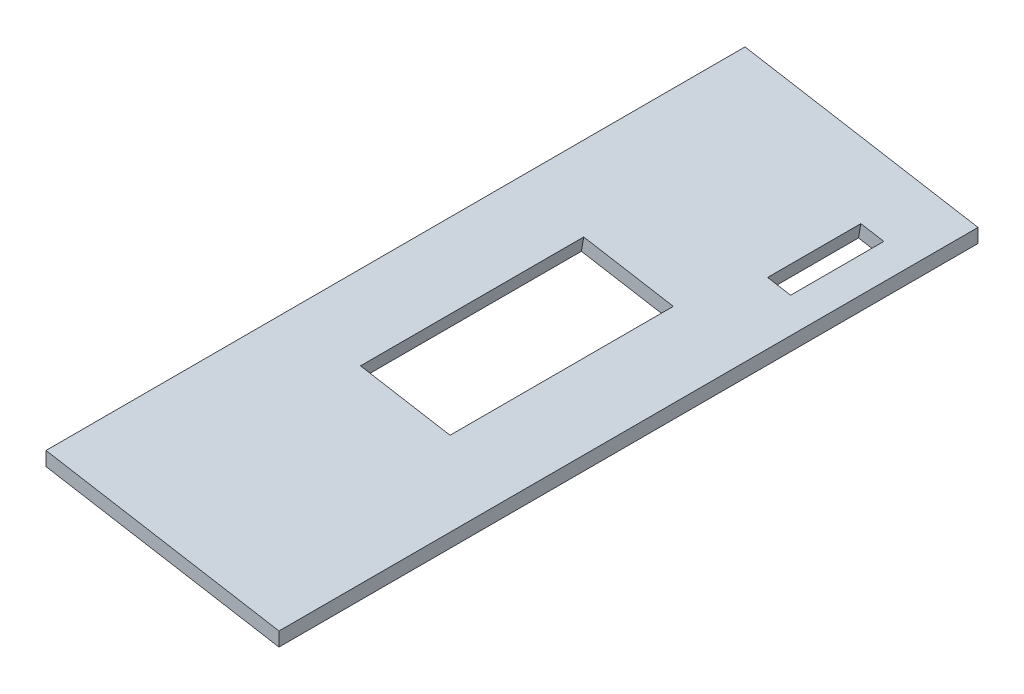
ISO-10303-21;
HEADER;
FILE_DESCRIPTION(('STEP AP214'),'2;1');
FILE_NAME('part.step','',(''),(''),'','','');
FILE_SCHEMA(('AUTOMOTIVE_DESIGN { 1 0 10303 214 1 1 1 1 }'));
ENDSEC;
DATA;
#1=APPLICATION_CONTEXT('core data for automotive mechanical design processes');
#2=APPLICATION_PROTOCOL_DEFINITION('international standard','automotive_design',2000,#1);
#3=PRODUCT_CONTEXT('',#1,'mechanical');
#4=PRODUCT('Part','Part','',(#3));
#5=PRODUCT_RELATED_PRODUCT_CATEGORY('part','',(#4));
#6=PRODUCT_DEFINITION_FORMATION('','',#4);
#7=PRODUCT_DEFINITION_CONTEXT('part definition',#1,'design');
#8=PRODUCT_DEFINITION('design','',#6,#7);
#9=PRODUCT_DEFINITION_SHAPE('','',#8);
#10=(LENGTH_UNIT() NAMED_UNIT(*) SI_UNIT(.MILLI.,.METRE.));
#11=(NAMED_UNIT(*) PLANE_ANGLE_UNIT() SI_UNIT($,.RADIAN.));
#12=(NAMED_UNIT(*) SI_UNIT($,.STERADIAN.) SOLID_ANGLE_UNIT());
#13=UNCERTAINTY_MEASURE_WITH_UNIT(LENGTH_MEASURE(1.E-05),#10,'distance_accuracy_value','');
#14=(GEOMETRIC_REPRESENTATION_CONTEXT(3) GLOBAL_UNCERTAINTY_ASSIGNED_CONTEXT((#13)) GLOBAL_UNIT_ASSIGNED_CONTEXT((#10,
#11,#12)) REPRESENTATION_CONTEXT('',''));
#15=CARTESIAN_POINT('',(0.,0.,0.));
#16=DIRECTION('',(0.,0.,1.));
#17=DIRECTION('',(1.,0.,0.));
#18=AXIS2_PLACEMENT_3D('',#15,#16,#17);
#19=CARTESIAN_POINT('',(-31.7951654155456,-27.4303947217968,300.));
#20=DIRECTION('',(0.168489379564996,0.985703469088855,0.));
#21=DIRECTION('',(-0.985703469088855,0.168489379564996,0.));
#22=AXIS2_PLACEMENT_3D('',#19,#20,#21);
#23=PLANE('',#22);
#24=DIRECTION('',(-0.985703469088855,0.168489379564996,0.));
#25=VECTOR('',#24,1.);
#26=CARTESIAN_POINT('',(-31.7951654155455,-27.4303947217968,27.6163170501561));
#27=LINE('',#26,#25);
#28=CARTESIAN_POINT('',(54.3942060906482,-42.1630137959683,27.6163170501561));
#29=VERTEX_POINT('',#28);
#30=CARTESIAN_POINT('',(44.5371713997597,-40.4781200003183,27.6163170501561));
#31=VERTEX_POINT('',#30);
#32=EDGE_CURVE('E152',#29,#31,#27,.T.);
#33=ORIENTED_EDGE('',*,*,#32,.T.);
#34=DIRECTION('',(0.,0.,1.));
#35=VECTOR('',#34,1.);
#36=CARTESIAN_POINT('',(44.5371713997597,-40.4781200003183,300.));
#37=LINE('',#36,#35);
#38=CARTESIAN_POINT('',(44.5371713997597,-40.4781200003183,67.6163170501561));
#39=VERTEX_POINT('',#38);
#40=EDGE_CURVE('E155',#31,#39,#37,.T.);
#41=ORIENTED_EDGE('',*,*,#40,.T.);
#42=DIRECTION('',(0.985703469088855,-0.168489379564996,0.));
#43=VECTOR('',#42,1.);
#44=CARTESIAN_POINT('',(-31.7951654155459,-27.4303947217967,67.6163170501562));
#45=LINE('',#44,#43);
#46=CARTESIAN_POINT('',(54.3942060906482,-42.1630137959683,67.6163170501561));
#47=VERTEX_POINT('',#46);
#48=EDGE_CURVE('E147',#39,#47,#45,.T.);
#49=ORIENTED_EDGE('',*,*,#48,.T.);
#50=DIRECTION('',(0.,0.,-1.));
#51=VECTOR('',#50,1.);
#52=CARTESIAN_POINT('',(54.3942060906483,-42.1630137959683,300.));
#53=LINE('',#52,#51);
#54=EDGE_CURVE('E127',#47,#29,#53,.T.);
#55=ORIENTED_EDGE('',*,*,#54,.T.);
#56=EDGE_LOOP('',(#33,#41,#49,#55));
#57=FACE_BOUND('',#56,.T.);
#58=DIRECTION('',(-0.985703469088855,0.168489379564996,0.));
#59=VECTOR('',#58,1.);
#60=CARTESIAN_POINT('',(-31.7951654155456,-27.4303947217968,100.));
#61=LINE('',#60,#59);
#62=CARTESIAN_POINT('',(36.429568836036,-39.0922621144938,100.));
#63=VERTEX_POINT('',#62);
#64=CARTESIAN_POINT('',(-2.01286645842935,-32.521176311459,100.));
#65=VERTEX_POINT('',#64);
#66=EDGE_CURVE('E184',#63,#65,#61,.T.);
#67=ORIENTED_EDGE('',*,*,#66,.T.);
#68=DIRECTION('',(0.,0.,1.));
#69=VECTOR('',#68,1.);
#70=CARTESIAN_POINT('',(-2.01286645842931,-32.521176311459,300.));
#71=LINE('',#70,#69);
#72=CARTESIAN_POINT('',(-2.01286645842933,-32.521176311459,195.8));
#73=VERTEX_POINT('',#72);
#74=EDGE_CURVE('E187',#65,#73,#71,.T.);
#75=ORIENTED_EDGE('',*,*,#74,.T.);
#76=DIRECTION('',(0.985703469088855,-0.168489379564996,0.));
#77=VECTOR('',#76,1.);
#78=CARTESIAN_POINT('',(-31.7951654155456,-27.4303947217968,195.8));
#79=LINE('',#78,#77);
#80=CARTESIAN_POINT('',(36.429568836036,-39.0922621144938,195.8));
#81=VERTEX_POINT('',#80);
#82=EDGE_CURVE('E172',#73,#81,#79,.T.);
#83=ORIENTED_EDGE('',*,*,#82,.T.);
#84=DIRECTION('',(0.,0.,-1.));
#85=VECTOR('',#84,1.);
#86=CARTESIAN_POINT('',(36.429568836036,-39.0922621144938,300.));
#87=LINE('',#86,#85);
#88=EDGE_CURVE('E181',#81,#63,#87,.T.);
#89=ORIENTED_EDGE('',*,*,#88,.T.);
#90=EDGE_LOOP('',(#67,#75,#83,#89));
#91=FACE_BOUND('',#90,.T.);
#92=DIRECTION('',(0.985703469088855,-0.168489379564996,0.));
#93=VECTOR('',#92,1.);
#94=CARTESIAN_POINT('',(-31.7951654155456,-27.4303947217968,0.));
#95=LINE('',#94,#93);
#96=CARTESIAN_POINT('',(-31.7951654155456,-27.4303947217968,0.));
#97=VERTEX_POINT('',#96);
#98=CARTESIAN_POINT('',(68.2048345844544,-44.5237077564704,0.));
#99=VERTEX_POINT('',#98);
#100=EDGE_CURVE('E190',#97,#99,#95,.T.);
#101=ORIENTED_EDGE('',*,*,#100,.T.);
#102=DIRECTION('',(0.,0.,-1.));
#103=VECTOR('',#102,1.);
#104=CARTESIAN_POINT('',(68.2048345844544,-44.5237077564704,300.));
#105=LINE('',#104,#103);
#106=CARTESIAN_POINT('',(68.2048345844544,-44.5237077564704,300.));
#107=VERTEX_POINT('',#106);
#108=EDGE_CURVE('E11',#107,#99,#105,.T.);
#109=ORIENTED_EDGE('',*,*,#108,.F.);
#110=DIRECTION('',(0.985703469088855,-0.168489379564996,0.));
#111=VECTOR('',#110,1.);
#112=CARTESIAN_POINT('',(-31.7951654155456,-27.4303947217968,300.));
#113=LINE('',#112,#111);
#114=CARTESIAN_POINT('',(-31.7951654155456,-27.4303947217968,300.));
#115=VERTEX_POINT('',#114);
#116=EDGE_CURVE('E191',#115,#107,#113,.T.);
#117=ORIENTED_EDGE('',*,*,#116,.F.);
#118=DIRECTION('',(0.,0.,-1.));
#119=VECTOR('',#118,1.);
#120=CARTESIAN_POINT('',(-31.7951654155456,-27.4303947217968,300.));
#121=LINE('',#120,#119);
#122=EDGE_CURVE('E201',#115,#97,#121,.T.);
#123=ORIENTED_EDGE('',*,*,#122,.T.);
#124=EDGE_LOOP('',(#101,#109,#117,#123));
#125=FACE_BOUND('',#124,.T.);
#126=ADVANCED_FACE('F33',(#57,#91,#125),#23,.F.);
#127=CARTESIAN_POINT('',(68.2048345844544,-44.5237077564704,300.));
#128=DIRECTION('',(-1.,0.,0.));
#129=DIRECTION('',(0.,0.,1.));
#130=AXIS2_PLACEMENT_3D('',#127,#128,#129);
#131=PLANE('',#130);
#132=DIRECTION('',(0.,1.,0.));
#133=VECTOR('',#132,1.);
#134=CARTESIAN_POINT('',(68.2048345844544,-44.5237077564704,0.));
#135=LINE('',#134,#133);
#136=CARTESIAN_POINT('',(68.2048345844544,-38.5237077564704,0.));
#137=VERTEX_POINT('',#136);
#138=EDGE_CURVE('E204',#99,#137,#135,.T.);
#139=ORIENTED_EDGE('',*,*,#138,.T.);
#140=DIRECTION('',(0.,0.,-1.));
#141=VECTOR('',#140,1.);
#142=CARTESIAN_POINT('',(68.2048345844544,-38.5237077564704,300.));
#143=LINE('',#142,#141);
#144=CARTESIAN_POINT('',(68.2048345844544,-38.5237077564704,300.));
#145=VERTEX_POINT('',#144);
#146=EDGE_CURVE('E40',#145,#137,#143,.T.);
#147=ORIENTED_EDGE('',*,*,#146,.F.);
#148=DIRECTION('',(0.,1.,0.));
#149=VECTOR('',#148,1.);
#150=CARTESIAN_POINT('',(68.2048345844544,-44.5237077564704,300.));
#151=LINE('',#150,#149);
#152=EDGE_CURVE('E194',#107,#145,#151,.T.);
#153=ORIENTED_EDGE('',*,*,#152,.F.);
#154=ORIENTED_EDGE('',*,*,#108,.T.);
#155=EDGE_LOOP('',(#139,#147,#153,#154));
#156=FACE_BOUND('',#155,.T.);
#157=ADVANCED_FACE('F233',(#156),#131,.F.);
#158=CARTESIAN_POINT('',(68.2048345844544,-38.5237077564704,300.));
#159=DIRECTION('',(-0.168489379564996,-0.985703469088855,0.));
#160=DIRECTION('',(0.985703469088855,-0.168489379564996,0.));
#161=AXIS2_PLACEMENT_3D('',#158,#159,#160);
#162=PLANE('',#161);
#163=DIRECTION('',(0.985703469088855,-0.168489379564995,0.));
#164=VECTOR('',#163,1.);
#165=CARTESIAN_POINT('',(45.5336547954107,-34.6484520264755,67.6163170501561));
#166=LINE('',#165,#164);
#167=CARTESIAN_POINT('',(45.5336547954107,-34.6484520264755,67.6163170501561));
#168=VERTEX_POINT('',#167);
#169=CARTESIAN_POINT('',(55.3906894862993,-36.3333458221255,67.6163170501561));
#170=VERTEX_POINT('',#169);
#171=EDGE_CURVE('E133',#168,#170,#166,.T.);
#172=ORIENTED_EDGE('',*,*,#171,.F.);
#173=DIRECTION('',(0.,0.,1.));
#174=VECTOR('',#173,1.);
#175=CARTESIAN_POINT('',(45.5336547954107,-34.6484520264755,27.6163170501561));
#176=LINE('',#175,#174);
#177=CARTESIAN_POINT('',(45.5336547954107,-34.6484520264755,27.6163170501561));
#178=VERTEX_POINT('',#177);
#179=EDGE_CURVE('E55',#178,#168,#176,.T.);
#180=ORIENTED_EDGE('',*,*,#179,.F.);
#181=DIRECTION('',(-0.985703469088855,0.168489379564996,0.));
#182=VECTOR('',#181,1.);
#183=CARTESIAN_POINT('',(45.5336547954107,-34.6484520264755,27.6163170501561));
#184=LINE('',#183,#182);
#185=CARTESIAN_POINT('',(55.3906894862993,-36.3333458221255,27.6163170501561));
#186=VERTEX_POINT('',#185);
#187=EDGE_CURVE('E140',#186,#178,#184,.T.);
#188=ORIENTED_EDGE('',*,*,#187,.F.);
#189=DIRECTION('',(0.,0.,-1.));
#190=VECTOR('',#189,1.);
#191=CARTESIAN_POINT('',(55.3906894862993,-36.3333458221255,27.6163170501561));
#192=LINE('',#191,#190);
#193=EDGE_CURVE('E124',#170,#186,#192,.T.);
#194=ORIENTED_EDGE('',*,*,#193,.F.);
#195=EDGE_LOOP('',(#172,#180,#188,#194));
#196=FACE_BOUND('',#195,.T.);
#197=DIRECTION('',(0.985703469088855,-0.168489379564996,0.));
#198=VECTOR('',#197,1.);
#199=CARTESIAN_POINT('',(-1.01638306277827,-26.6915083376162,195.8));
#200=LINE('',#199,#198);
#201=CARTESIAN_POINT('',(-1.01638306277826,-26.6915083376162,195.8));
#202=VERTEX_POINT('',#201);
#203=CARTESIAN_POINT('',(37.4260522316871,-33.262594140651,195.8));
#204=VERTEX_POINT('',#203);
#205=EDGE_CURVE('E160',#202,#204,#200,.T.);
#206=ORIENTED_EDGE('',*,*,#205,.F.);
#207=DIRECTION('',(0.,0.,1.));
#208=VECTOR('',#207,1.);
#209=CARTESIAN_POINT('',(-1.01638306277827,-26.6915083376162,195.8));
#210=LINE('',#209,#208);
#211=CARTESIAN_POINT('',(-1.01638306277829,-26.6915083376162,100.));
#212=VERTEX_POINT('',#211);
#213=EDGE_CURVE('E158',#212,#202,#210,.T.);
#214=ORIENTED_EDGE('',*,*,#213,.F.);
#215=DIRECTION('',(-0.985703469088855,0.168489379564996,0.));
#216=VECTOR('',#215,1.);
#217=CARTESIAN_POINT('',(-1.01638306277829,-26.6915083376162,100.));
#218=LINE('',#217,#216);
#219=CARTESIAN_POINT('',(37.4260522316871,-33.262594140651,100.));
#220=VERTEX_POINT('',#219);
#221=EDGE_CURVE('E166',#220,#212,#218,.T.);
#222=ORIENTED_EDGE('',*,*,#221,.F.);
#223=DIRECTION('',(0.,0.,-1.));
#224=VECTOR('',#223,1.);
#225=CARTESIAN_POINT('',(37.4260522316871,-33.262594140651,195.8));
#226=LINE('',#225,#224);
#227=EDGE_CURVE('E163',#204,#220,#226,.T.);
#228=ORIENTED_EDGE('',*,*,#227,.F.);
#229=EDGE_LOOP('',(#206,#214,#222,#228));
#230=FACE_BOUND('',#229,.T.);
#231=DIRECTION('',(-0.985703469088855,0.168489379564996,0.));
#232=VECTOR('',#231,1.);
#233=CARTESIAN_POINT('',(68.2048345844544,-38.5237077564704,0.));
#234=LINE('',#233,#232);
#235=CARTESIAN_POINT('',(-31.7951654155456,-21.4303947217968,0.));
#236=VERTEX_POINT('',#235);
#237=EDGE_CURVE('E206',#137,#236,#234,.T.);
#238=ORIENTED_EDGE('',*,*,#237,.T.);
#239=DIRECTION('',(0.,0.,-1.));
#240=VECTOR('',#239,1.);
#241=CARTESIAN_POINT('',(-31.7951654155456,-21.4303947217968,300.));
#242=LINE('',#241,#240);
#243=CARTESIAN_POINT('',(-31.7951654155456,-21.4303947217968,300.));
#244=VERTEX_POINT('',#243);
#245=EDGE_CURVE('E211',#244,#236,#242,.T.);
#246=ORIENTED_EDGE('',*,*,#245,.F.);
#247=DIRECTION('',(-0.985703469088855,0.168489379564996,0.));
#248=VECTOR('',#247,1.);
#249=CARTESIAN_POINT('',(68.2048345844544,-38.5237077564704,300.));
#250=LINE('',#249,#248);
#251=EDGE_CURVE('E197',#145,#244,#250,.T.);
#252=ORIENTED_EDGE('',*,*,#251,.F.);
#253=ORIENTED_EDGE('',*,*,#146,.T.);
#254=EDGE_LOOP('',(#238,#246,#252,#253));
#255=FACE_BOUND('',#254,.T.);
#256=ADVANCED_FACE('F137',(#196,#230,#255),#162,.F.);
#257=CARTESIAN_POINT('',(-31.7951654155456,-21.4303947217968,300.));
#258=DIRECTION('',(1.,0.,0.));
#259=DIRECTION('',(0.,1.,0.));
#260=AXIS2_PLACEMENT_3D('',#257,#258,#259);
#261=PLANE('',#260);
#262=DIRECTION('',(0.,-1.,0.));
#263=VECTOR('',#262,1.);
#264=CARTESIAN_POINT('',(-31.7951654155456,-21.4303947217968,0.));
#265=LINE('',#264,#263);
#266=EDGE_CURVE('E195',#236,#97,#265,.T.);
#267=ORIENTED_EDGE('',*,*,#266,.T.);
#268=ORIENTED_EDGE('',*,*,#122,.F.);
#269=DIRECTION('',(0.,-1.,0.));
#270=VECTOR('',#269,1.);
#271=CARTESIAN_POINT('',(-31.7951654155456,-21.4303947217968,300.));
#272=LINE('',#271,#270);
#273=EDGE_CURVE('E199',#244,#115,#272,.T.);
#274=ORIENTED_EDGE('',*,*,#273,.F.);
#275=ORIENTED_EDGE('',*,*,#245,.T.);
#276=EDGE_LOOP('',(#267,#268,#274,#275));
#277=FACE_BOUND('',#276,.T.);
#278=ADVANCED_FACE('F226',(#277),#261,.F.);
#279=CARTESIAN_POINT('',(0.,0.,300.));
#280=DIRECTION('',(0.,0.,1.));
#281=DIRECTION('',(1.,0.,0.));
#282=AXIS2_PLACEMENT_3D('',#279,#280,#281);
#283=PLANE('',#282);
#284=ORIENTED_EDGE('',*,*,#116,.T.);
#285=ORIENTED_EDGE('',*,*,#152,.T.);
#286=ORIENTED_EDGE('',*,*,#251,.T.);
#287=ORIENTED_EDGE('',*,*,#273,.T.);
#288=EDGE_LOOP('',(#284,#285,#286,#287));
#289=FACE_BOUND('',#288,.T.);
#290=ADVANCED_FACE('F232',(#289),#283,.T.);
#291=CARTESIAN_POINT('',(0.,0.,0.));
#292=DIRECTION('',(0.,0.,1.));
#293=DIRECTION('',(1.,0.,0.));
#294=AXIS2_PLACEMENT_3D('',#291,#292,#293);
#295=PLANE('',#294);
#296=ORIENTED_EDGE('',*,*,#100,.F.);
#297=ORIENTED_EDGE('',*,*,#266,.F.);
#298=ORIENTED_EDGE('',*,*,#237,.F.);
#299=ORIENTED_EDGE('',*,*,#138,.F.);
#300=EDGE_LOOP('',(#296,#297,#298,#299));
#301=FACE_BOUND('',#300,.T.);
#302=ADVANCED_FACE('F223',(#301),#295,.F.);
#303=CARTESIAN_POINT('',(-3.5437237562532,-41.477060373949,195.8));
#304=DIRECTION('',(-0.985703469088855,0.168489379564996,0.));
#305=DIRECTION('',(-0.168489379564996,-0.985703469088855,0.));
#306=AXIS2_PLACEMENT_3D('',#303,#304,#305);
#307=PLANE('',#306);
#308=DIRECTION('',(0.168489379564996,0.985703469088855,0.));
#309=VECTOR('',#308,1.);
#310=CARTESIAN_POINT('',(-3.54372375625322,-41.477060373949,100.));
#311=LINE('',#310,#309);
#312=EDGE_CURVE('E170',#65,#212,#311,.T.);
#313=ORIENTED_EDGE('',*,*,#312,.T.);
#314=ORIENTED_EDGE('',*,*,#213,.T.);
#315=DIRECTION('',(0.168489379564996,0.985703469088855,0.));
#316=VECTOR('',#315,1.);
#317=CARTESIAN_POINT('',(-3.5437237562532,-41.477060373949,195.8));
#318=LINE('',#317,#316);
#319=EDGE_CURVE('E169',#73,#202,#318,.T.);
#320=ORIENTED_EDGE('',*,*,#319,.F.);
#321=ORIENTED_EDGE('',*,*,#74,.F.);
#322=EDGE_LOOP('',(#313,#314,#320,#321));
#323=FACE_BOUND('',#322,.T.);
#324=ADVANCED_FACE('F246',(#323),#307,.F.);
#325=CARTESIAN_POINT('',(-3.54372375625322,-41.477060373949,100.));
#326=DIRECTION('',(0.,0.,-1.));
#327=DIRECTION('',(-1.,0.,0.));
#328=AXIS2_PLACEMENT_3D('',#325,#326,#327);
#329=PLANE('',#328);
#330=DIRECTION('',(0.168489379564996,0.985703469088855,0.));
#331=VECTOR('',#330,1.);
#332=CARTESIAN_POINT('',(34.8987115382121,-48.0481461769839,100.));
#333=LINE('',#332,#331);
#334=EDGE_CURVE('E173',#63,#220,#333,.T.);
#335=ORIENTED_EDGE('',*,*,#334,.T.);
#336=ORIENTED_EDGE('',*,*,#221,.T.);
#337=ORIENTED_EDGE('',*,*,#312,.F.);
#338=ORIENTED_EDGE('',*,*,#66,.F.);
#339=EDGE_LOOP('',(#335,#336,#337,#338));
#340=FACE_BOUND('',#339,.T.);
#341=ADVANCED_FACE('F251',(#340),#329,.F.);
#342=CARTESIAN_POINT('',(34.8987115382121,-48.0481461769838,195.8));
#343=DIRECTION('',(0.985703469088855,-0.168489379564996,0.));
#344=DIRECTION('',(0.168489379564996,0.985703469088855,0.));
#345=AXIS2_PLACEMENT_3D('',#342,#343,#344);
#346=PLANE('',#345);
#347=DIRECTION('',(0.168489379564996,0.985703469088855,0.));
#348=VECTOR('',#347,1.);
#349=CARTESIAN_POINT('',(34.8987115382121,-48.0481461769838,195.8));
#350=LINE('',#349,#348);
#351=EDGE_CURVE('E175',#81,#204,#350,.T.);
#352=ORIENTED_EDGE('',*,*,#351,.T.);
#353=ORIENTED_EDGE('',*,*,#227,.T.);
#354=ORIENTED_EDGE('',*,*,#334,.F.);
#355=ORIENTED_EDGE('',*,*,#88,.F.);
#356=EDGE_LOOP('',(#352,#353,#354,#355));
#357=FACE_BOUND('',#356,.T.);
#358=ADVANCED_FACE('F257',(#357),#346,.F.);
#359=CARTESIAN_POINT('',(-3.5437237562532,-41.477060373949,195.8));
#360=DIRECTION('',(0.,0.,1.));
#361=DIRECTION('',(1.,0.,0.));
#362=AXIS2_PLACEMENT_3D('',#359,#360,#361);
#363=PLANE('',#362);
#364=ORIENTED_EDGE('',*,*,#319,.T.);
#365=ORIENTED_EDGE('',*,*,#205,.T.);
#366=ORIENTED_EDGE('',*,*,#351,.F.);
#367=ORIENTED_EDGE('',*,*,#82,.F.);
#368=EDGE_LOOP('',(#364,#365,#366,#367));
#369=FACE_BOUND('',#368,.T.);
#370=ADVANCED_FACE('F253',(#369),#363,.F.);
#371=CARTESIAN_POINT('',(43.8487609997608,-44.5054867173641,27.6163170501561));
#372=DIRECTION('',(-0.985703469088855,0.168489379564996,0.));
#373=DIRECTION('',(-0.168489379564996,-0.985703469088855,0.));
#374=AXIS2_PLACEMENT_3D('',#371,#372,#373);
#375=PLANE('',#374);
#376=DIRECTION('',(0.168489379564996,0.985703469088855,0.));
#377=VECTOR('',#376,1.);
#378=CARTESIAN_POINT('',(43.8487609997608,-44.5054867173641,27.6163170501561));
#379=LINE('',#378,#377);
#380=EDGE_CURVE('E145',#31,#178,#379,.T.);
#381=ORIENTED_EDGE('',*,*,#380,.T.);
#382=ORIENTED_EDGE('',*,*,#179,.T.);
#383=DIRECTION('',(0.168489379564996,0.985703469088855,0.));
#384=VECTOR('',#383,1.);
#385=CARTESIAN_POINT('',(43.8487609997608,-44.5054867173641,67.6163170501561));
#386=LINE('',#385,#384);
#387=EDGE_CURVE('E130',#39,#168,#386,.T.);
#388=ORIENTED_EDGE('',*,*,#387,.F.);
#389=ORIENTED_EDGE('',*,*,#40,.F.);
#390=EDGE_LOOP('',(#381,#382,#388,#389));
#391=FACE_BOUND('',#390,.T.);
#392=ADVANCED_FACE('F256',(#391),#375,.F.);
#393=CARTESIAN_POINT('',(43.8487609997608,-44.5054867173641,27.6163170501561));
#394=DIRECTION('',(0.,0.,-1.));
#395=DIRECTION('',(-1.,0.,0.));
#396=AXIS2_PLACEMENT_3D('',#393,#394,#395);
#397=PLANE('',#396);
#398=DIRECTION('',(0.168489379564996,0.985703469088855,0.));
#399=VECTOR('',#398,1.);
#400=CARTESIAN_POINT('',(53.7057956906493,-46.190380513014,27.6163170501561));
#401=LINE('',#400,#399);
#402=EDGE_CURVE('E129',#29,#186,#401,.T.);
#403=ORIENTED_EDGE('',*,*,#402,.T.);
#404=ORIENTED_EDGE('',*,*,#187,.T.);
#405=ORIENTED_EDGE('',*,*,#380,.F.);
#406=ORIENTED_EDGE('',*,*,#32,.F.);
#407=EDGE_LOOP('',(#403,#404,#405,#406));
#408=FACE_BOUND('',#407,.T.);
#409=ADVANCED_FACE('F267',(#408),#397,.F.);
#410=CARTESIAN_POINT('',(53.7057956906493,-46.190380513014,27.6163170501561));
#411=DIRECTION('',(0.985703469088855,-0.168489379564996,0.));
#412=DIRECTION('',(0.168489379564996,0.985703469088855,0.));
#413=AXIS2_PLACEMENT_3D('',#410,#411,#412);
#414=PLANE('',#413);
#415=DIRECTION('',(0.168489379564996,0.985703469088855,0.));
#416=VECTOR('',#415,1.);
#417=CARTESIAN_POINT('',(53.7057956906493,-46.190380513014,67.6163170501561));
#418=LINE('',#417,#416);
#419=EDGE_CURVE('E47',#47,#170,#418,.T.);
#420=ORIENTED_EDGE('',*,*,#419,.T.);
#421=ORIENTED_EDGE('',*,*,#193,.T.);
#422=ORIENTED_EDGE('',*,*,#402,.F.);
#423=ORIENTED_EDGE('',*,*,#54,.F.);
#424=EDGE_LOOP('',(#420,#421,#422,#423));
#425=FACE_BOUND('',#424,.T.);
#426=ADVANCED_FACE('F121',(#425),#414,.F.);
#427=CARTESIAN_POINT('',(43.8487609997608,-44.5054867173641,67.6163170501561));
#428=DIRECTION('',(0.,0.,1.));
#429=DIRECTION('',(1.,0.,0.));
#430=AXIS2_PLACEMENT_3D('',#427,#428,#429);
#431=PLANE('',#430);
#432=ORIENTED_EDGE('',*,*,#387,.T.);
#433=ORIENTED_EDGE('',*,*,#171,.T.);
#434=ORIENTED_EDGE('',*,*,#419,.F.);
#435=ORIENTED_EDGE('',*,*,#48,.F.);
#436=EDGE_LOOP('',(#432,#433,#434,#435));
#437=FACE_BOUND('',#436,.T.);
#438=ADVANCED_FACE('F134',(#437),#431,.F.);
#439=CLOSED_SHELL('',(#126,#157,#256,#278,#290,#302,#324,#341,#358,#370,#392,#409,#426,#438));
#440=MANIFOLD_SOLID_BREP('B2',#439);
#441=ADVANCED_BREP_SHAPE_REPRESENTATION('',(#18,#440),#14);
#442=SHAPE_DEFINITION_REPRESENTATION(#9,#441);
ENDSEC;
END-ISO-10303-21;
